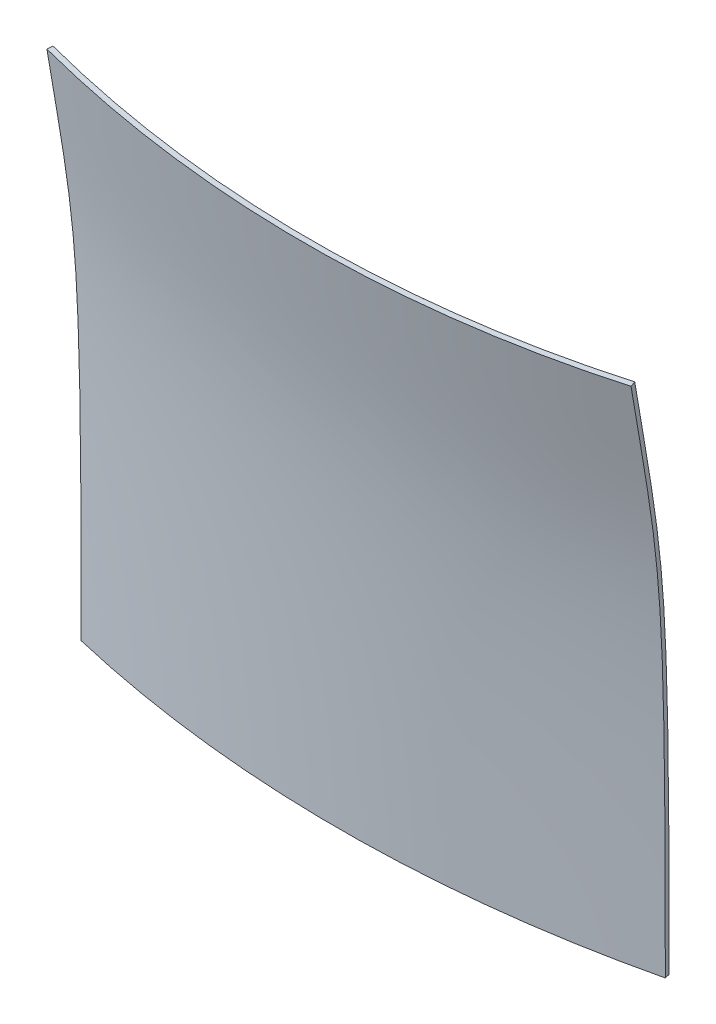
ISO-10303-21;
HEADER;
FILE_DESCRIPTION(('STEP AP214'),'2;1');
FILE_NAME('part.step','',(''),(''),'','','');
FILE_SCHEMA(('AUTOMOTIVE_DESIGN { 1 0 10303 214 1 1 1 1 }'));
ENDSEC;
DATA;
#1=APPLICATION_CONTEXT('core data for automotive mechanical design processes');
#2=APPLICATION_PROTOCOL_DEFINITION('international standard','automotive_design',2000,#1);
#3=PRODUCT_CONTEXT('',#1,'mechanical');
#4=PRODUCT('Part','Part','',(#3));
#5=PRODUCT_RELATED_PRODUCT_CATEGORY('part','',(#4));
#6=PRODUCT_DEFINITION_FORMATION('','',#4);
#7=PRODUCT_DEFINITION_CONTEXT('part definition',#1,'design');
#8=PRODUCT_DEFINITION('design','',#6,#7);
#9=PRODUCT_DEFINITION_SHAPE('','',#8);
#10=(LENGTH_UNIT() NAMED_UNIT(*) SI_UNIT(.MILLI.,.METRE.));
#11=(NAMED_UNIT(*) PLANE_ANGLE_UNIT() SI_UNIT($,.RADIAN.));
#12=(NAMED_UNIT(*) SI_UNIT($,.STERADIAN.) SOLID_ANGLE_UNIT());
#13=UNCERTAINTY_MEASURE_WITH_UNIT(LENGTH_MEASURE(1.E-05),#10,'distance_accuracy_value','');
#14=(GEOMETRIC_REPRESENTATION_CONTEXT(3) GLOBAL_UNCERTAINTY_ASSIGNED_CONTEXT((#13)) GLOBAL_UNIT_ASSIGNED_CONTEXT((#10,
#11,#12)) REPRESENTATION_CONTEXT('',''));
#15=CARTESIAN_POINT('',(0.,0.,0.));
#16=DIRECTION('',(0.,0.,1.));
#17=DIRECTION('',(1.,0.,0.));
#18=AXIS2_PLACEMENT_3D('',#15,#16,#17);
#19=CARTESIAN_POINT('',(215.9,120.893254420458,-1029.51677812609));
#20=DIRECTION('',(0.,0.98601329718327,0.166666666666666));
#21=DIRECTION('',(0.,-0.166666666666666,0.98601329718327));
#22=AXIS2_PLACEMENT_3D('',#19,#20,#21);
#23=PLANE('',#22);
#24=CARTESIAN_POINT('',(215.9,120.893254420458,-1029.51677812609));
#25=DIRECTION('',(0.,-0.98601329718327,-0.166666666666666));
#26=DIRECTION('',(0.,-0.166666666666666,0.98601329718327));
#27=AXIS2_PLACEMENT_3D('',#24,#25,#26);
#28=CIRCLE('',#27,952.075561082888);
#29=CARTESIAN_POINT('',(434.3497161889,-33.5526724266893,-115.802352723594));
#30=VERTEX_POINT('',#29);
#31=CARTESIAN_POINT('',(-2.54971618890004,-33.5526724266893,-115.802352723594));
#32=VERTEX_POINT('',#31);
#33=EDGE_CURVE('E143',#30,#32,#28,.T.);
#34=ORIENTED_EDGE('',*,*,#33,.T.);
#35=DIRECTION('',(-0.229445776278968,-0.162220240871933,0.959707887432001));
#36=VECTOR('',#35,1.);
#37=CARTESIAN_POINT('',(-3.42390459652292,-34.1707315444114,-112.145865672478));
#38=LINE('',#37,#36);
#39=CARTESIAN_POINT('',(-3.42390459652292,-34.1707315444114,-112.145865672478));
#40=VERTEX_POINT('',#39);
#41=EDGE_CURVE('E170',#32,#40,#38,.T.);
#42=ORIENTED_EDGE('',*,*,#41,.T.);
#43=CARTESIAN_POINT('',(215.9,120.893254420458,-1029.51677812609));
#44=DIRECTION('',(0.,0.98601329718327,0.166666666666666));
#45=DIRECTION('',(0.,-0.166666666666666,0.98601329718327));
#46=AXIS2_PLACEMENT_3D('',#43,#44,#45);
#47=CIRCLE('',#46,955.885561082888);
#48=CARTESIAN_POINT('',(435.223904596523,-34.1707315444114,-112.145865672478));
#49=VERTEX_POINT('',#48);
#50=EDGE_CURVE('E136',#40,#49,#47,.T.);
#51=ORIENTED_EDGE('',*,*,#50,.T.);
#52=DIRECTION('',(-0.229445776278981,0.162220240871932,-0.959707887431998));
#53=VECTOR('',#52,1.);
#54=CARTESIAN_POINT('',(434.3497161889,-33.5526724266893,-115.802352723594));
#55=LINE('',#54,#53);
#56=EDGE_CURVE('E140',#49,#30,#55,.T.);
#57=ORIENTED_EDGE('',*,*,#56,.T.);
#58=EDGE_LOOP('',(#34,#42,#51,#57));
#59=FACE_BOUND('',#58,.T.);
#60=ADVANCED_FACE('F98',(#59),#23,.T.);
#61=CARTESIAN_POINT('',(215.9,-431.8,-1068.25952652276));
#62=DIRECTION('',(0.,1.,0.));
#63=DIRECTION('',(0.,0.,1.));
#64=AXIS2_PLACEMENT_3D('',#61,#62,#63);
#65=PLANE('',#64);
#66=CARTESIAN_POINT('',(215.9,-431.8,-1068.25952652276));
#67=DIRECTION('',(0.,-1.,0.));
#68=DIRECTION('',(0.,0.,1.));
#69=AXIS2_PLACEMENT_3D('',#66,#67,#68);
#70=CIRCLE('',#69,952.075561082892);
#71=CARTESIAN_POINT('',(434.3497161889,-431.8,-141.583965439864));
#72=VERTEX_POINT('',#71);
#73=CARTESIAN_POINT('',(-2.54971618890004,-431.8,-141.583965439864));
#74=VERTEX_POINT('',#73);
#75=EDGE_CURVE('E186',#72,#74,#70,.T.);
#76=ORIENTED_EDGE('',*,*,#75,.F.);
#77=DIRECTION('',(-0.229445776278959,0.,-0.973321445231608));
#78=VECTOR('',#77,1.);
#79=CARTESIAN_POINT('',(434.3497161889,-431.8,-141.583965439864));
#80=LINE('',#79,#78);
#81=CARTESIAN_POINT('',(435.223904596523,-431.8,-137.875610733531));
#82=VERTEX_POINT('',#81);
#83=EDGE_CURVE('E167',#82,#72,#80,.T.);
#84=ORIENTED_EDGE('',*,*,#83,.F.);
#85=CARTESIAN_POINT('',(215.9,-431.8,-1068.25952652276));
#86=DIRECTION('',(0.,1.,0.));
#87=DIRECTION('',(0.,0.,1.));
#88=AXIS2_PLACEMENT_3D('',#85,#86,#87);
#89=CIRCLE('',#88,955.885561082892);
#90=CARTESIAN_POINT('',(-3.423904596523,-431.8,-137.875610733531));
#91=VERTEX_POINT('',#90);
#92=EDGE_CURVE('E109',#91,#82,#89,.T.);
#93=ORIENTED_EDGE('',*,*,#92,.F.);
#94=DIRECTION('',(-0.229445776278993,0.,0.9733214452316));
#95=VECTOR('',#94,1.);
#96=CARTESIAN_POINT('',(-2.54971618890004,-431.8,-141.583965439864));
#97=LINE('',#96,#95);
#98=EDGE_CURVE('E12',#74,#91,#97,.T.);
#99=ORIENTED_EDGE('',*,*,#98,.F.);
#100=EDGE_LOOP('',(#76,#84,#93,#99));
#101=FACE_BOUND('',#100,.T.);
#102=ADVANCED_FACE('F240',(#101),#65,.F.);
#103=CARTESIAN_POINT('',(-2.54971618890004,-431.8,-141.583965439864));
#104=CARTESIAN_POINT('',(-2.54971618890004,-165.74601594285,-141.583965439864));
#105=CARTESIAN_POINT('',(-2.54971618890004,-164.719055451157,-137.97351806169));
#106=CARTESIAN_POINT('',(-2.54971618890004,-33.5526724266893,-115.802352723594));
#107=CARTESIAN_POINT('',(-2.84111232477436,-431.8,-140.34784720442));
#108=CARTESIAN_POINT('',(-2.84111232477436,-165.883820085894,-140.34784720442));
#109=CARTESIAN_POINT('',(-2.84111232477434,-164.85713679834,-136.743205366064));
#110=CARTESIAN_POINT('',(-2.84111232477433,-33.7586921325967,-114.583523706556));
#111=CARTESIAN_POINT('',(-3.13250846064868,-431.8,-139.111728968976));
#112=CARTESIAN_POINT('',(-3.13250846064868,-166.021624228939,-139.111728968976));
#113=CARTESIAN_POINT('',(-3.13250846064863,-164.995218145523,-135.512892670439));
#114=CARTESIAN_POINT('',(-3.13250846064863,-33.964711838504,-113.364694689517));
#115=CARTESIAN_POINT('',(-3.423904596523,-431.8,-137.875610733531));
#116=CARTESIAN_POINT('',(-3.423904596523,-166.159428371984,-137.875610733531));
#117=CARTESIAN_POINT('',(-3.42390459652292,-165.133299492706,-134.282579974813));
#118=CARTESIAN_POINT('',(-3.42390459652292,-34.1707315444114,-112.145865672478));
#119=B_SPLINE_SURFACE_WITH_KNOTS('',3,3,((#103,#104,#105,#106),(#107,#108,#109,#110),(#111,#112,
#113,#114),(#115,#116,#117,#118)),.UNSPECIFIED.,.F.,.F.,.F.,(4,4),(4,4),(0.,1.),(0.,1.),.UNSPECIFIED.);
#120=CARTESIAN_POINT('',(-3.423904596523,-431.8,-137.875610733531));
#121=CARTESIAN_POINT('',(-3.423904596523,-166.159428371984,-137.875610733531));
#122=CARTESIAN_POINT('',(-3.42390459652292,-165.133299492706,-134.282579974813));
#123=CARTESIAN_POINT('',(-3.42390459652292,-34.1707315444114,-112.145865672478));
#124=B_SPLINE_CURVE_WITH_KNOTS('',3,(#120,#121,#122,#123),.UNSPECIFIED.,.F.,.F.,(4,4),(0.,1.),.UNSPECIFIED.);
#125=EDGE_CURVE('E118',#91,#40,#124,.T.);
#126=CARTESIAN_POINT('',(-2.54971618890004,-431.8,-141.583965439864));
#127=CARTESIAN_POINT('',(-2.54971618890004,-165.74601594285,-141.583965439864));
#128=CARTESIAN_POINT('',(-2.54971618890004,-164.719055451157,-137.97351806169));
#129=CARTESIAN_POINT('',(-2.54971618890004,-33.5526724266893,-115.802352723594));
#130=B_SPLINE_CURVE_WITH_KNOTS('',3,(#126,#127,#128,#129),.UNSPECIFIED.,.F.,.F.,(4,4),(0.,1.),.UNSPECIFIED.);
#131=EDGE_CURVE('E160',#32,#74,#130,.F.);
#132=ORIENTED_EDGE('',*,*,#98,.T.);
#133=ORIENTED_EDGE('',*,*,#125,.T.);
#134=ORIENTED_EDGE('',*,*,#41,.F.);
#135=ORIENTED_EDGE('',*,*,#131,.T.);
#136=EDGE_LOOP('',(#132,#133,#134,#135));
#137=FACE_BOUND('',#136,.T.);
#138=ADVANCED_FACE('F248',(#137),#119,.T.);
#139=CARTESIAN_POINT('',(-3.42390459652339,-431.8,-137.875610733531));
#140=CARTESIAN_POINT('',(-3.42390459652339,-166.159428371984,-137.875610733531));
#141=CARTESIAN_POINT('',(-3.42390459652328,-165.133299492706,-134.282579974813));
#142=CARTESIAN_POINT('',(-3.42390459652328,-34.1707315444114,-112.145865672479));
#143=CARTESIAN_POINT('',(140.81170035437,-431.8,-103.874253312346));
#144=CARTESIAN_POINT('',(140.81170035437,-166.159428371984,-103.874253312346));
#145=CARTESIAN_POINT('',(140.81170035437,-170.800192396237,-100.756789435243));
#146=CARTESIAN_POINT('',(140.81170035437,-39.8376244479423,-78.6200751329085));
#147=CARTESIAN_POINT('',(290.98829964563,-431.8,-103.874253312346));
#148=CARTESIAN_POINT('',(290.98829964563,-166.159428371984,-103.874253312346));
#149=CARTESIAN_POINT('',(290.98829964563,-170.800192396237,-100.756789435243));
#150=CARTESIAN_POINT('',(290.98829964563,-39.8376244479423,-78.6200751329085));
#151=CARTESIAN_POINT('',(435.223904596523,-431.8,-137.875610733531));
#152=CARTESIAN_POINT('',(435.223904596523,-166.159428371984,-137.875610733531));
#153=CARTESIAN_POINT('',(435.223904596523,-165.133299492706,-134.282579974813));
#154=CARTESIAN_POINT('',(435.223904596523,-34.1707315444114,-112.145865672478));
#155=B_SPLINE_SURFACE_WITH_KNOTS('',3,3,((#139,#140,#141,#142),(#143,#144,#145,#146),(#147,#148,
#149,#150),(#151,#152,#153,#154)),.UNSPECIFIED.,.F.,.F.,.F.,(4,4),(4,4),(0.,1.),(0.,1.),.UNSPECIFIED.);
#156=CARTESIAN_POINT('',(435.223904596523,-431.8,-137.875610733531));
#157=CARTESIAN_POINT('',(435.223904596523,-166.159428371984,-137.875610733531));
#158=CARTESIAN_POINT('',(435.223904596523,-165.133299492706,-134.282579974813));
#159=CARTESIAN_POINT('',(435.223904596523,-34.1707315444114,-112.145865672478));
#160=B_SPLINE_CURVE_WITH_KNOTS('',3,(#156,#157,#158,#159),.UNSPECIFIED.,.F.,.F.,(4,4),(0.,1.),.UNSPECIFIED.);
#161=EDGE_CURVE('E169',#82,#49,#160,.T.);
#162=ORIENTED_EDGE('',*,*,#92,.T.);
#163=ORIENTED_EDGE('',*,*,#161,.T.);
#164=ORIENTED_EDGE('',*,*,#50,.F.);
#165=ORIENTED_EDGE('',*,*,#125,.F.);
#166=EDGE_LOOP('',(#162,#163,#164,#165));
#167=FACE_BOUND('',#166,.T.);
#168=ADVANCED_FACE('F202',(#167),#155,.T.);
#169=CARTESIAN_POINT('',(434.349716188901,-431.8,-141.583965439864));
#170=CARTESIAN_POINT('',(434.349716188901,-165.74601594285,-141.583965439864));
#171=CARTESIAN_POINT('',(434.3497161889,-164.719055451157,-137.97351806169));
#172=CARTESIAN_POINT('',(434.3497161889,-33.5526724266893,-115.802352723595));
#173=CARTESIAN_POINT('',(290.689010239767,-431.8,-107.718131743535));
#174=CARTESIAN_POINT('',(290.689010239767,-165.74601594285,-107.718131743535));
#175=CARTESIAN_POINT('',(290.689010239767,-170.363361067212,-104.581355716913));
#176=CARTESIAN_POINT('',(290.689010239767,-39.1969780427441,-82.410190378817));
#177=CARTESIAN_POINT('',(141.110989760234,-431.8,-107.718131743535));
#178=CARTESIAN_POINT('',(141.110989760234,-165.74601594285,-107.718131743535));
#179=CARTESIAN_POINT('',(141.110989760234,-170.363361067212,-104.581355716913));
#180=CARTESIAN_POINT('',(141.110989760234,-39.1969780427441,-82.4101903788171));
#181=CARTESIAN_POINT('',(-2.54971618890004,-431.8,-141.583965439864));
#182=CARTESIAN_POINT('',(-2.54971618890004,-165.74601594285,-141.583965439864));
#183=CARTESIAN_POINT('',(-2.54971618890007,-164.719055451157,-137.97351806169));
#184=CARTESIAN_POINT('',(-2.54971618890007,-33.5526724266893,-115.802352723595));
#185=B_SPLINE_SURFACE_WITH_KNOTS('',3,3,((#169,#170,#171,#172),(#173,#174,#175,#176),(#177,#178,
#179,#180),(#181,#182,#183,#184)),.UNSPECIFIED.,.F.,.F.,.F.,(4,4),(4,4),(0.,1.),(0.,1.),.UNSPECIFIED.);
#186=CARTESIAN_POINT('',(434.3497161889,-431.8,-141.583965439864));
#187=CARTESIAN_POINT('',(434.3497161889,-165.74601594285,-141.583965439864));
#188=CARTESIAN_POINT('',(434.3497161889,-164.719055451157,-137.97351806169));
#189=CARTESIAN_POINT('',(434.3497161889,-33.5526724266893,-115.802352723594));
#190=B_SPLINE_CURVE_WITH_KNOTS('',3,(#186,#187,#188,#189),.UNSPECIFIED.,.F.,.F.,(4,4),(0.,1.),.UNSPECIFIED.);
#191=EDGE_CURVE('E157',#72,#30,#190,.T.);
#192=ORIENTED_EDGE('',*,*,#75,.T.);
#193=ORIENTED_EDGE('',*,*,#131,.F.);
#194=ORIENTED_EDGE('',*,*,#33,.F.);
#195=ORIENTED_EDGE('',*,*,#191,.F.);
#196=EDGE_LOOP('',(#192,#193,#194,#195));
#197=FACE_BOUND('',#196,.T.);
#198=ADVANCED_FACE('F156',(#197),#185,.T.);
#199=CARTESIAN_POINT('',(435.223904596523,-431.8,-137.875610733531));
#200=CARTESIAN_POINT('',(435.223904596523,-166.159428371984,-137.875610733531));
#201=CARTESIAN_POINT('',(435.223904596523,-165.133299492706,-134.282579974813));
#202=CARTESIAN_POINT('',(435.223904596523,-34.1707315444114,-112.145865672478));
#203=CARTESIAN_POINT('',(434.932508460649,-431.8,-139.111728968976));
#204=CARTESIAN_POINT('',(434.932508460649,-166.021624228939,-139.111728968976));
#205=CARTESIAN_POINT('',(434.932508460649,-164.995218145523,-135.512892670439));
#206=CARTESIAN_POINT('',(434.932508460649,-33.9647118385041,-113.364694689517));
#207=CARTESIAN_POINT('',(434.641112324774,-431.8,-140.34784720442));
#208=CARTESIAN_POINT('',(434.641112324774,-165.883820085894,-140.34784720442));
#209=CARTESIAN_POINT('',(434.641112324774,-164.85713679834,-136.743205366064));
#210=CARTESIAN_POINT('',(434.641112324774,-33.7586921325967,-114.583523706556));
#211=CARTESIAN_POINT('',(434.3497161889,-431.8,-141.583965439864));
#212=CARTESIAN_POINT('',(434.3497161889,-165.74601594285,-141.583965439864));
#213=CARTESIAN_POINT('',(434.3497161889,-164.719055451157,-137.97351806169));
#214=CARTESIAN_POINT('',(434.3497161889,-33.5526724266893,-115.802352723594));
#215=B_SPLINE_SURFACE_WITH_KNOTS('',3,3,((#199,#200,#201,#202),(#203,#204,#205,#206),(#207,#208,
#209,#210),(#211,#212,#213,#214)),.UNSPECIFIED.,.F.,.F.,.F.,(4,4),(4,4),(0.,1.),(0.,1.),.UNSPECIFIED.);
#216=ORIENTED_EDGE('',*,*,#83,.T.);
#217=ORIENTED_EDGE('',*,*,#191,.T.);
#218=ORIENTED_EDGE('',*,*,#56,.F.);
#219=ORIENTED_EDGE('',*,*,#161,.F.);
#220=EDGE_LOOP('',(#216,#217,#218,#219));
#221=FACE_BOUND('',#220,.T.);
#222=ADVANCED_FACE('F165',(#221),#215,.T.);
#223=CLOSED_SHELL('',(#60,#102,#138,#168,#198,#222));
#224=MANIFOLD_SOLID_BREP('B2',#223);
#225=ADVANCED_BREP_SHAPE_REPRESENTATION('',(#18,#224),#14);
#226=SHAPE_DEFINITION_REPRESENTATION(#9,#225);
ENDSEC;
END-ISO-10303-21;
